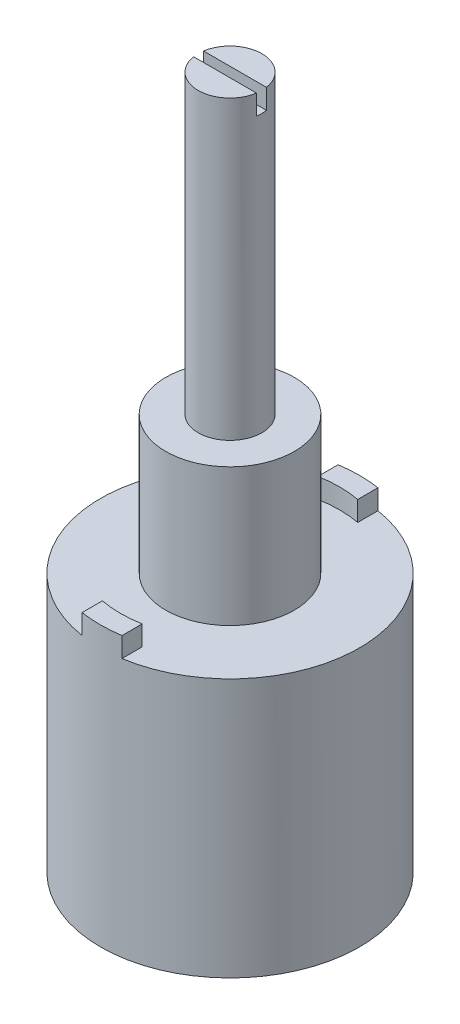
ISO-10303-21;
HEADER;
FILE_DESCRIPTION(('STEP AP214'),'2;1');
FILE_NAME('part.step','',(''),(''),'','','');
FILE_SCHEMA(('AUTOMOTIVE_DESIGN { 1 0 10303 214 1 1 1 1 }'));
ENDSEC;
DATA;
#1=APPLICATION_CONTEXT('core data for automotive mechanical design processes');
#2=APPLICATION_PROTOCOL_DEFINITION('international standard','automotive_design',2000,#1);
#3=PRODUCT_CONTEXT('',#1,'mechanical');
#4=PRODUCT('Part','Part','',(#3));
#5=PRODUCT_RELATED_PRODUCT_CATEGORY('part','',(#4));
#6=PRODUCT_DEFINITION_FORMATION('','',#4);
#7=PRODUCT_DEFINITION_CONTEXT('part definition',#1,'design');
#8=PRODUCT_DEFINITION('design','',#6,#7);
#9=PRODUCT_DEFINITION_SHAPE('','',#8);
#10=(LENGTH_UNIT() NAMED_UNIT(*) SI_UNIT(.MILLI.,.METRE.));
#11=(NAMED_UNIT(*) PLANE_ANGLE_UNIT() SI_UNIT($,.RADIAN.));
#12=(NAMED_UNIT(*) SI_UNIT($,.STERADIAN.) SOLID_ANGLE_UNIT());
#13=UNCERTAINTY_MEASURE_WITH_UNIT(LENGTH_MEASURE(1.E-05),#10,'distance_accuracy_value','');
#14=(GEOMETRIC_REPRESENTATION_CONTEXT(3) GLOBAL_UNCERTAINTY_ASSIGNED_CONTEXT((#13)) GLOBAL_UNIT_ASSIGNED_CONTEXT((#10,
#11,#12)) REPRESENTATION_CONTEXT('',''));
#15=CARTESIAN_POINT('',(0.,0.,0.));
#16=DIRECTION('',(0.,0.,1.));
#17=DIRECTION('',(1.,0.,0.));
#18=AXIS2_PLACEMENT_3D('',#15,#16,#17);
#19=CARTESIAN_POINT('',(0.,34.78,0.));
#20=DIRECTION('',(0.,-1.,0.));
#21=DIRECTION('',(0.,0.,-1.));
#22=AXIS2_PLACEMENT_3D('',#19,#20,#21);
#23=CYLINDRICAL_SURFACE('',#22,1.6);
#24=CARTESIAN_POINT('',(0.,19.9,0.));
#25=DIRECTION('',(0.,1.,0.));
#26=DIRECTION('',(0.,0.,1.));
#27=AXIS2_PLACEMENT_3D('',#24,#25,#26);
#28=CIRCLE('',#27,1.6);
#29=CARTESIAN_POINT('',(0.,19.9,1.6));
#30=VERTEX_POINT('',#29);
#31=EDGE_CURVE('E205',#30,#30,#28,.T.);
#32=ORIENTED_EDGE('',*,*,#31,.T.);
#33=EDGE_LOOP('',(#32));
#34=FACE_BOUND('',#33,.T.);
#35=DIRECTION('',(0.,1.,0.));
#36=VECTOR('',#35,1.);
#37=CARTESIAN_POINT('',(1.58034806292791,33.78,0.25));
#38=LINE('',#37,#36);
#39=CARTESIAN_POINT('',(1.58034806292791,33.78,0.25));
#40=VERTEX_POINT('',#39);
#41=CARTESIAN_POINT('',(1.58034806292791,34.78,0.25));
#42=VERTEX_POINT('',#41);
#43=EDGE_CURVE('E161',#40,#42,#38,.T.);
#44=ORIENTED_EDGE('',*,*,#43,.T.);
#45=CARTESIAN_POINT('',(0.,34.78,0.));
#46=DIRECTION('',(0.,1.,0.));
#47=DIRECTION('',(0.,0.,1.));
#48=AXIS2_PLACEMENT_3D('',#45,#46,#47);
#49=CIRCLE('',#48,1.6);
#50=CARTESIAN_POINT('',(-1.58034806292791,34.78,0.25));
#51=VERTEX_POINT('',#50);
#52=EDGE_CURVE('E206',#51,#42,#49,.T.);
#53=ORIENTED_EDGE('',*,*,#52,.F.);
#54=DIRECTION('',(0.,1.,0.));
#55=VECTOR('',#54,1.);
#56=CARTESIAN_POINT('',(-1.58034806292791,33.78,0.25));
#57=LINE('',#56,#55);
#58=CARTESIAN_POINT('',(-1.58034806292791,33.78,0.25));
#59=VERTEX_POINT('',#58);
#60=EDGE_CURVE('E142',#59,#51,#57,.T.);
#61=ORIENTED_EDGE('',*,*,#60,.F.);
#62=CARTESIAN_POINT('',(0.,33.78,0.));
#63=DIRECTION('',(0.,1.,0.));
#64=DIRECTION('',(0.,0.,1.));
#65=AXIS2_PLACEMENT_3D('',#62,#63,#64);
#66=CIRCLE('',#65,1.6);
#67=CARTESIAN_POINT('',(-1.58034806292791,33.78,-0.25));
#68=VERTEX_POINT('',#67);
#69=EDGE_CURVE('E127',#68,#59,#66,.T.);
#70=ORIENTED_EDGE('',*,*,#69,.F.);
#71=DIRECTION('',(0.,1.,0.));
#72=VECTOR('',#71,1.);
#73=CARTESIAN_POINT('',(-1.58034806292791,33.78,-0.25));
#74=LINE('',#73,#72);
#75=CARTESIAN_POINT('',(-1.58034806292791,34.78,-0.25));
#76=VERTEX_POINT('',#75);
#77=EDGE_CURVE('E123',#68,#76,#74,.T.);
#78=ORIENTED_EDGE('',*,*,#77,.T.);
#79=CARTESIAN_POINT('',(1.58034806292791,34.78,-0.25));
#80=VERTEX_POINT('',#79);
#81=EDGE_CURVE('E140',#80,#76,#49,.T.);
#82=ORIENTED_EDGE('',*,*,#81,.F.);
#83=DIRECTION('',(0.,1.,0.));
#84=VECTOR('',#83,1.);
#85=CARTESIAN_POINT('',(1.58034806292791,33.78,-0.25));
#86=LINE('',#85,#84);
#87=CARTESIAN_POINT('',(1.58034806292791,33.78,-0.25));
#88=VERTEX_POINT('',#87);
#89=EDGE_CURVE('E48',#88,#80,#86,.T.);
#90=ORIENTED_EDGE('',*,*,#89,.F.);
#91=EDGE_CURVE('E128',#40,#88,#66,.T.);
#92=ORIENTED_EDGE('',*,*,#91,.F.);
#93=EDGE_LOOP('',(#44,#53,#61,#70,#78,#82,#90,#92));
#94=FACE_BOUND('',#93,.T.);
#95=ADVANCED_FACE('F32',(#34,#94),#23,.T.);
#96=CARTESIAN_POINT('',(0.,34.78,0.));
#97=DIRECTION('',(0.,1.,0.));
#98=DIRECTION('',(0.,0.,1.));
#99=AXIS2_PLACEMENT_3D('',#96,#97,#98);
#100=PLANE('',#99);
#101=ORIENTED_EDGE('',*,*,#52,.T.);
#102=DIRECTION('',(-1.,0.,0.));
#103=VECTOR('',#102,1.);
#104=CARTESIAN_POINT('',(0.,34.78,0.25));
#105=LINE('',#104,#103);
#106=EDGE_CURVE('E136',#42,#51,#105,.T.);
#107=ORIENTED_EDGE('',*,*,#106,.T.);
#108=EDGE_LOOP('',(#101,#107));
#109=FACE_BOUND('',#108,.T.);
#110=ADVANCED_FACE('F230',(#109),#100,.T.);
#111=CARTESIAN_POINT('',(0.,13.,0.));
#112=DIRECTION('',(0.,1.,0.));
#113=DIRECTION('',(0.,0.,1.));
#114=AXIS2_PLACEMENT_3D('',#111,#112,#113);
#115=PLANE('',#114);
#116=CARTESIAN_POINT('',(0.,13.,0.));
#117=DIRECTION('',(0.,1.,0.));
#118=DIRECTION('',(0.,0.,1.));
#119=AXIS2_PLACEMENT_3D('',#116,#117,#118);
#120=CIRCLE('',#119,3.225);
#121=CARTESIAN_POINT('',(0.,13.,-3.225));
#122=VERTEX_POINT('',#121);
#123=EDGE_CURVE('E214',#122,#122,#120,.T.);
#124=ORIENTED_EDGE('',*,*,#123,.F.);
#125=EDGE_LOOP('',(#124));
#126=FACE_BOUND('',#125,.T.);
#127=CARTESIAN_POINT('',(0.,13.,0.));
#128=DIRECTION('',(0.,1.,0.));
#129=DIRECTION('',(0.,0.,1.));
#130=AXIS2_PLACEMENT_3D('',#127,#128,#129);
#131=CIRCLE('',#130,6.5);
#132=CARTESIAN_POINT('',(-1.,13.,-6.42261628933257));
#133=VERTEX_POINT('',#132);
#134=CARTESIAN_POINT('',(-1.,13.,6.42261628933257));
#135=VERTEX_POINT('',#134);
#136=EDGE_CURVE('E11',#133,#135,#131,.T.);
#137=ORIENTED_EDGE('',*,*,#136,.T.);
#138=DIRECTION('',(0.,0.,1.));
#139=VECTOR('',#138,1.);
#140=CARTESIAN_POINT('',(-1.,13.,0.));
#141=LINE('',#140,#139);
#142=CARTESIAN_POINT('',(-1.,13.,5.40832691319598));
#143=VERTEX_POINT('',#142);
#144=EDGE_CURVE('E55',#143,#135,#141,.T.);
#145=ORIENTED_EDGE('',*,*,#144,.F.);
#146=CARTESIAN_POINT('',(0.,13.,0.));
#147=DIRECTION('',(0.,1.,0.));
#148=DIRECTION('',(0.,0.,1.));
#149=AXIS2_PLACEMENT_3D('',#146,#147,#148);
#150=CIRCLE('',#149,5.5);
#151=CARTESIAN_POINT('',(1.,13.,5.40832691319598));
#152=VERTEX_POINT('',#151);
#153=EDGE_CURVE('E159',#143,#152,#150,.T.);
#154=ORIENTED_EDGE('',*,*,#153,.T.);
#155=DIRECTION('',(0.,0.,1.));
#156=VECTOR('',#155,1.);
#157=CARTESIAN_POINT('',(1.,13.,0.));
#158=LINE('',#157,#156);
#159=CARTESIAN_POINT('',(1.,13.,6.42261628933257));
#160=VERTEX_POINT('',#159);
#161=EDGE_CURVE('E151',#152,#160,#158,.T.);
#162=ORIENTED_EDGE('',*,*,#161,.T.);
#163=CARTESIAN_POINT('',(1.,13.,-6.42261628933257));
#164=VERTEX_POINT('',#163);
#165=EDGE_CURVE('E41',#160,#164,#131,.T.);
#166=ORIENTED_EDGE('',*,*,#165,.T.);
#167=DIRECTION('',(0.,0.,1.));
#168=VECTOR('',#167,1.);
#169=CARTESIAN_POINT('',(1.,13.,0.));
#170=LINE('',#169,#168);
#171=CARTESIAN_POINT('',(1.,13.,-5.40832691319598));
#172=VERTEX_POINT('',#171);
#173=EDGE_CURVE('E190',#164,#172,#170,.T.);
#174=ORIENTED_EDGE('',*,*,#173,.T.);
#175=CARTESIAN_POINT('',(0.,13.,0.));
#176=DIRECTION('',(0.,1.,0.));
#177=DIRECTION('',(0.,0.,1.));
#178=AXIS2_PLACEMENT_3D('',#175,#176,#177);
#179=CIRCLE('',#178,5.5);
#180=CARTESIAN_POINT('',(-1.,13.,-5.40832691319598));
#181=VERTEX_POINT('',#180);
#182=EDGE_CURVE('E175',#172,#181,#179,.T.);
#183=ORIENTED_EDGE('',*,*,#182,.T.);
#184=DIRECTION('',(0.,0.,-1.));
#185=VECTOR('',#184,1.);
#186=CARTESIAN_POINT('',(-1.,13.,0.));
#187=LINE('',#186,#185);
#188=EDGE_CURVE('E180',#181,#133,#187,.T.);
#189=ORIENTED_EDGE('',*,*,#188,.T.);
#190=EDGE_LOOP('',(#137,#145,#154,#162,#166,#174,#183,#189));
#191=FACE_BOUND('',#190,.T.);
#192=ADVANCED_FACE('F232',(#126,#191),#115,.T.);
#193=CARTESIAN_POINT('',(0.,19.9,0.));
#194=DIRECTION('',(0.,1.,0.));
#195=DIRECTION('',(0.,0.,1.));
#196=AXIS2_PLACEMENT_3D('',#193,#194,#195);
#197=PLANE('',#196);
#198=CARTESIAN_POINT('',(0.,19.9,0.));
#199=DIRECTION('',(0.,1.,0.));
#200=DIRECTION('',(0.,0.,1.));
#201=AXIS2_PLACEMENT_3D('',#198,#199,#200);
#202=CIRCLE('',#201,3.225);
#203=CARTESIAN_POINT('',(0.,19.9,-3.225));
#204=VERTEX_POINT('',#203);
#205=EDGE_CURVE('E211',#204,#204,#202,.T.);
#206=ORIENTED_EDGE('',*,*,#205,.T.);
#207=EDGE_LOOP('',(#206));
#208=FACE_BOUND('',#207,.T.);
#209=ORIENTED_EDGE('',*,*,#31,.F.);
#210=EDGE_LOOP('',(#209));
#211=FACE_BOUND('',#210,.T.);
#212=ADVANCED_FACE('F238',(#208,#211),#197,.T.);
#213=CARTESIAN_POINT('',(0.,13.,0.));
#214=DIRECTION('',(0.,-1.,0.));
#215=DIRECTION('',(0.,0.,-1.));
#216=AXIS2_PLACEMENT_3D('',#213,#214,#215);
#217=CYLINDRICAL_SURFACE('',#216,6.5);
#218=ORIENTED_EDGE('',*,*,#136,.F.);
#219=DIRECTION('',(0.,-1.,0.));
#220=VECTOR('',#219,1.);
#221=CARTESIAN_POINT('',(-1.,14.,-6.42261628933257));
#222=LINE('',#221,#220);
#223=CARTESIAN_POINT('',(-1.,14.,-6.42261628933257));
#224=VERTEX_POINT('',#223);
#225=EDGE_CURVE('E196',#224,#133,#222,.T.);
#226=ORIENTED_EDGE('',*,*,#225,.F.);
#227=CARTESIAN_POINT('',(0.,14.,0.));
#228=DIRECTION('',(0.,1.,0.));
#229=DIRECTION('',(0.,0.,1.));
#230=AXIS2_PLACEMENT_3D('',#227,#228,#229);
#231=CIRCLE('',#230,6.5);
#232=CARTESIAN_POINT('',(1.,14.,-6.42261628933257));
#233=VERTEX_POINT('',#232);
#234=EDGE_CURVE('E183',#233,#224,#231,.T.);
#235=ORIENTED_EDGE('',*,*,#234,.F.);
#236=DIRECTION('',(0.,-1.,0.));
#237=VECTOR('',#236,1.);
#238=CARTESIAN_POINT('',(1.,14.,-6.42261628933257));
#239=LINE('',#238,#237);
#240=EDGE_CURVE('E199',#233,#164,#239,.T.);
#241=ORIENTED_EDGE('',*,*,#240,.T.);
#242=ORIENTED_EDGE('',*,*,#165,.F.);
#243=DIRECTION('',(0.,-1.,0.));
#244=VECTOR('',#243,1.);
#245=CARTESIAN_POINT('',(1.,14.,6.42261628933257));
#246=LINE('',#245,#244);
#247=CARTESIAN_POINT('',(1.,14.,6.42261628933257));
#248=VERTEX_POINT('',#247);
#249=EDGE_CURVE('E167',#248,#160,#246,.T.);
#250=ORIENTED_EDGE('',*,*,#249,.F.);
#251=CARTESIAN_POINT('',(0.,14.,0.));
#252=DIRECTION('',(0.,1.,0.));
#253=DIRECTION('',(0.,0.,1.));
#254=AXIS2_PLACEMENT_3D('',#251,#252,#253);
#255=CIRCLE('',#254,6.5);
#256=CARTESIAN_POINT('',(-1.,14.,6.42261628933257));
#257=VERTEX_POINT('',#256);
#258=EDGE_CURVE('E153',#257,#248,#255,.T.);
#259=ORIENTED_EDGE('',*,*,#258,.F.);
#260=DIRECTION('',(0.,-1.,0.));
#261=VECTOR('',#260,1.);
#262=CARTESIAN_POINT('',(-1.,14.,6.42261628933257));
#263=LINE('',#262,#261);
#264=EDGE_CURVE('E170',#257,#135,#263,.T.);
#265=ORIENTED_EDGE('',*,*,#264,.T.);
#266=EDGE_LOOP('',(#218,#226,#235,#241,#242,#250,#259,#265));
#267=FACE_BOUND('',#266,.T.);
#268=CARTESIAN_POINT('',(0.,0.,0.));
#269=DIRECTION('',(0.,1.,0.));
#270=DIRECTION('',(0.,0.,1.));
#271=AXIS2_PLACEMENT_3D('',#268,#269,#270);
#272=CIRCLE('',#271,6.5);
#273=CARTESIAN_POINT('',(0.,0.,6.5));
#274=VERTEX_POINT('',#273);
#275=EDGE_CURVE('E36',#274,#274,#272,.T.);
#276=ORIENTED_EDGE('',*,*,#275,.T.);
#277=EDGE_LOOP('',(#276));
#278=FACE_BOUND('',#277,.T.);
#279=ADVANCED_FACE('F34',(#267,#278),#217,.T.);
#280=CARTESIAN_POINT('',(0.,0.,0.));
#281=DIRECTION('',(0.,1.,0.));
#282=DIRECTION('',(0.,0.,1.));
#283=AXIS2_PLACEMENT_3D('',#280,#281,#282);
#284=PLANE('',#283);
#285=ORIENTED_EDGE('',*,*,#275,.F.);
#286=EDGE_LOOP('',(#285));
#287=FACE_BOUND('',#286,.T.);
#288=ADVANCED_FACE('F253',(#287),#284,.F.);
#289=CARTESIAN_POINT('',(0.,19.9,0.));
#290=DIRECTION('',(0.,-1.,0.));
#291=DIRECTION('',(0.,0.,-1.));
#292=AXIS2_PLACEMENT_3D('',#289,#290,#291);
#293=CYLINDRICAL_SURFACE('',#292,3.225);
#294=CARTESIAN_POINT('',(0.,19.9,-3.225));
#295=CARTESIAN_POINT('',(0.,19.828125,-3.225));
#296=CARTESIAN_POINT('',(0.,19.75625,-3.225));
#297=CARTESIAN_POINT('',(0.,19.6125,-3.225));
#298=CARTESIAN_POINT('',(0.,19.540625,-3.225));
#299=CARTESIAN_POINT('',(0.,19.396875,-3.225));
#300=CARTESIAN_POINT('',(0.,19.325,-3.225));
#301=CARTESIAN_POINT('',(0.,19.18125,-3.225));
#302=CARTESIAN_POINT('',(0.,19.109375,-3.225));
#303=CARTESIAN_POINT('',(0.,18.965625,-3.225));
#304=CARTESIAN_POINT('',(0.,18.89375,-3.225));
#305=CARTESIAN_POINT('',(0.,18.75,-3.225));
#306=CARTESIAN_POINT('',(0.,18.678125,-3.225));
#307=CARTESIAN_POINT('',(0.,18.534375,-3.225));
#308=CARTESIAN_POINT('',(0.,18.4625,-3.225));
#309=CARTESIAN_POINT('',(0.,18.31875,-3.225));
#310=CARTESIAN_POINT('',(0.,18.246875,-3.225));
#311=CARTESIAN_POINT('',(0.,18.103125,-3.225));
#312=CARTESIAN_POINT('',(0.,18.03125,-3.225));
#313=CARTESIAN_POINT('',(0.,17.8875,-3.225));
#314=CARTESIAN_POINT('',(0.,17.815625,-3.225));
#315=CARTESIAN_POINT('',(0.,17.671875,-3.225));
#316=CARTESIAN_POINT('',(0.,17.6,-3.225));
#317=CARTESIAN_POINT('',(0.,17.45625,-3.225));
#318=CARTESIAN_POINT('',(0.,17.384375,-3.225));
#319=CARTESIAN_POINT('',(0.,17.240625,-3.225));
#320=CARTESIAN_POINT('',(0.,17.16875,-3.225));
#321=CARTESIAN_POINT('',(0.,17.025,-3.225));
#322=CARTESIAN_POINT('',(0.,16.953125,-3.225));
#323=CARTESIAN_POINT('',(0.,16.809375,-3.225));
#324=CARTESIAN_POINT('',(0.,16.7375,-3.225));
#325=CARTESIAN_POINT('',(0.,16.59375,-3.225));
#326=CARTESIAN_POINT('',(0.,16.521875,-3.225));
#327=CARTESIAN_POINT('',(0.,16.378125,-3.225));
#328=CARTESIAN_POINT('',(0.,16.30625,-3.225));
#329=CARTESIAN_POINT('',(0.,16.1625,-3.225));
#330=CARTESIAN_POINT('',(0.,16.090625,-3.225));
#331=CARTESIAN_POINT('',(0.,15.946875,-3.225));
#332=CARTESIAN_POINT('',(0.,15.875,-3.225));
#333=CARTESIAN_POINT('',(0.,15.73125,-3.225));
#334=CARTESIAN_POINT('',(0.,15.659375,-3.225));
#335=CARTESIAN_POINT('',(0.,15.515625,-3.225));
#336=CARTESIAN_POINT('',(0.,15.44375,-3.225));
#337=CARTESIAN_POINT('',(0.,15.3,-3.225));
#338=CARTESIAN_POINT('',(0.,15.228125,-3.225));
#339=CARTESIAN_POINT('',(0.,15.084375,-3.225));
#340=CARTESIAN_POINT('',(0.,15.0125,-3.225));
#341=CARTESIAN_POINT('',(0.,14.86875,-3.225));
#342=CARTESIAN_POINT('',(0.,14.796875,-3.225));
#343=CARTESIAN_POINT('',(0.,14.653125,-3.225));
#344=CARTESIAN_POINT('',(0.,14.58125,-3.225));
#345=CARTESIAN_POINT('',(0.,14.4375,-3.225));
#346=CARTESIAN_POINT('',(0.,14.365625,-3.225));
#347=CARTESIAN_POINT('',(0.,14.221875,-3.225));
#348=CARTESIAN_POINT('',(0.,14.15,-3.225));
#349=CARTESIAN_POINT('',(0.,14.00625,-3.225));
#350=CARTESIAN_POINT('',(0.,13.934375,-3.225));
#351=CARTESIAN_POINT('',(0.,13.790625,-3.225));
#352=CARTESIAN_POINT('',(0.,13.71875,-3.225));
#353=CARTESIAN_POINT('',(0.,13.575,-3.225));
#354=CARTESIAN_POINT('',(0.,13.503125,-3.225));
#355=CARTESIAN_POINT('',(0.,13.359375,-3.225));
#356=CARTESIAN_POINT('',(0.,13.2875,-3.225));
#357=CARTESIAN_POINT('',(0.,13.14375,-3.225));
#358=CARTESIAN_POINT('',(0.,13.071875,-3.225));
#359=CARTESIAN_POINT('',(0.,13.,-3.225));
#360=B_SPLINE_CURVE_WITH_KNOTS('',3,(#294,#295,#296,#297,#298,#299,#300,#301,#302,#303,#304,
#305,#306,#307,#308,#309,#310,#311,#312,#313,#314,#315,#316,#317,#318,#319,#320,#321,#322,#323,
#324,#325,#326,#327,#328,#329,#330,#331,#332,#333,#334,#335,#336,#337,#338,#339,#340,#341,#342,
#343,#344,#345,#346,#347,#348,#349,#350,#351,#352,#353,#354,#355,#356,#357,#358,#359),
.UNSPECIFIED.,.F.,.F.,(4,2,2,2,2,2,2,2,2,2,2,2,2,2,2,2,2,2,2,2,2,2,2,2,2,2,2,2,2,2,2,2,4),(0.,
0.215624999999997,0.431249999999998,0.646874999999998,0.862499999999999,1.078125,1.29375,
1.509375,1.725,1.940625,2.15625,2.371875,2.5875,2.803125,3.01875,3.234375,3.45,3.665625,3.88125,
4.096875,4.3125,4.528125,4.74375,4.959375,5.175,5.390625,5.60625,5.821875,6.0375,6.253125,
6.46875,6.684375,6.9),.UNSPECIFIED.);
#361=EDGE_CURVE('BSEAM246',#204,#122,#360,.T.);
#362=ORIENTED_EDGE('',*,*,#205,.F.);
#363=ORIENTED_EDGE('',*,*,#123,.T.);
#364=ORIENTED_EDGE('',*,*,#361,.T.);
#365=ORIENTED_EDGE('',*,*,#361,.F.);
#366=EDGE_LOOP('',(#362,#364,#363,#365));
#367=FACE_BOUND('',#366,.T.);
#368=ADVANCED_FACE('F246',(#367),#293,.T.);
#369=DIRECTION('',(-1.,0.,0.));
#370=VECTOR('',#369,1.);
#371=CARTESIAN_POINT('',(0.,34.78,-0.25));
#372=LINE('',#371,#370);
#373=EDGE_CURVE('E220',#80,#76,#372,.T.);
#374=ORIENTED_EDGE('',*,*,#373,.F.);
#375=ORIENTED_EDGE('',*,*,#81,.T.);
#376=EDGE_LOOP('',(#374,#375));
#377=FACE_BOUND('',#376,.T.);
#378=ADVANCED_FACE('F219',(#377),#100,.T.);
#379=CARTESIAN_POINT('',(0.,14.,0.));
#380=DIRECTION('',(0.,-1.,0.));
#381=DIRECTION('',(0.,0.,-1.));
#382=AXIS2_PLACEMENT_3D('',#379,#380,#381);
#383=CYLINDRICAL_SURFACE('',#382,5.5);
#384=ORIENTED_EDGE('',*,*,#182,.F.);
#385=DIRECTION('',(0.,-1.,0.));
#386=VECTOR('',#385,1.);
#387=CARTESIAN_POINT('',(1.,14.,-5.40832691319598));
#388=LINE('',#387,#386);
#389=CARTESIAN_POINT('',(1.,14.,-5.40832691319598));
#390=VERTEX_POINT('',#389);
#391=EDGE_CURVE('E202',#390,#172,#388,.T.);
#392=ORIENTED_EDGE('',*,*,#391,.F.);
#393=CARTESIAN_POINT('',(0.,14.,0.));
#394=DIRECTION('',(0.,1.,0.));
#395=DIRECTION('',(0.,0.,1.));
#396=AXIS2_PLACEMENT_3D('',#393,#394,#395);
#397=CIRCLE('',#396,5.5);
#398=CARTESIAN_POINT('',(-1.,14.,-5.40832691319598));
#399=VERTEX_POINT('',#398);
#400=EDGE_CURVE('E176',#390,#399,#397,.T.);
#401=ORIENTED_EDGE('',*,*,#400,.T.);
#402=DIRECTION('',(0.,-1.,0.));
#403=VECTOR('',#402,1.);
#404=CARTESIAN_POINT('',(-1.,14.,-5.40832691319598));
#405=LINE('',#404,#403);
#406=EDGE_CURVE('E188',#399,#181,#405,.T.);
#407=ORIENTED_EDGE('',*,*,#406,.T.);
#408=EDGE_LOOP('',(#384,#392,#401,#407));
#409=FACE_BOUND('',#408,.T.);
#410=ADVANCED_FACE('F245',(#409),#383,.F.);
#411=CARTESIAN_POINT('',(1.,14.,0.));
#412=DIRECTION('',(1.,0.,0.));
#413=DIRECTION('',(0.,0.,-1.));
#414=AXIS2_PLACEMENT_3D('',#411,#412,#413);
#415=PLANE('',#414);
#416=ORIENTED_EDGE('',*,*,#173,.F.);
#417=ORIENTED_EDGE('',*,*,#240,.F.);
#418=DIRECTION('',(0.,0.,1.));
#419=VECTOR('',#418,1.);
#420=CARTESIAN_POINT('',(1.,14.,0.));
#421=LINE('',#420,#419);
#422=EDGE_CURVE('E179',#233,#390,#421,.T.);
#423=ORIENTED_EDGE('',*,*,#422,.T.);
#424=ORIENTED_EDGE('',*,*,#391,.T.);
#425=EDGE_LOOP('',(#416,#417,#423,#424));
#426=FACE_BOUND('',#425,.T.);
#427=ADVANCED_FACE('F251',(#426),#415,.T.);
#428=CARTESIAN_POINT('',(-1.,14.,0.));
#429=DIRECTION('',(-1.,0.,0.));
#430=DIRECTION('',(0.,0.,1.));
#431=AXIS2_PLACEMENT_3D('',#428,#429,#430);
#432=PLANE('',#431);
#433=ORIENTED_EDGE('',*,*,#188,.F.);
#434=ORIENTED_EDGE('',*,*,#406,.F.);
#435=DIRECTION('',(0.,0.,-1.));
#436=VECTOR('',#435,1.);
#437=CARTESIAN_POINT('',(-1.,14.,0.));
#438=LINE('',#437,#436);
#439=EDGE_CURVE('E185',#399,#224,#438,.T.);
#440=ORIENTED_EDGE('',*,*,#439,.T.);
#441=ORIENTED_EDGE('',*,*,#225,.T.);
#442=EDGE_LOOP('',(#433,#434,#440,#441));
#443=FACE_BOUND('',#442,.T.);
#444=ADVANCED_FACE('F286',(#443),#432,.T.);
#445=CARTESIAN_POINT('',(0.,14.,0.));
#446=DIRECTION('',(0.,1.,0.));
#447=DIRECTION('',(0.,0.,1.));
#448=AXIS2_PLACEMENT_3D('',#445,#446,#447);
#449=PLANE('',#448);
#450=ORIENTED_EDGE('',*,*,#400,.F.);
#451=ORIENTED_EDGE('',*,*,#422,.F.);
#452=ORIENTED_EDGE('',*,*,#234,.T.);
#453=ORIENTED_EDGE('',*,*,#439,.F.);
#454=EDGE_LOOP('',(#450,#451,#452,#453));
#455=FACE_BOUND('',#454,.T.);
#456=ADVANCED_FACE('F289',(#455),#449,.T.);
#457=CARTESIAN_POINT('',(0.,14.,0.));
#458=DIRECTION('',(0.,-1.,0.));
#459=DIRECTION('',(0.,0.,-1.));
#460=AXIS2_PLACEMENT_3D('',#457,#458,#459);
#461=CYLINDRICAL_SURFACE('',#460,5.5);
#462=ORIENTED_EDGE('',*,*,#153,.F.);
#463=DIRECTION('',(0.,-1.,0.));
#464=VECTOR('',#463,1.);
#465=CARTESIAN_POINT('',(-1.,14.,5.40832691319598));
#466=LINE('',#465,#464);
#467=CARTESIAN_POINT('',(-1.,14.,5.40832691319598));
#468=VERTEX_POINT('',#467);
#469=EDGE_CURVE('E173',#468,#143,#466,.T.);
#470=ORIENTED_EDGE('',*,*,#469,.F.);
#471=CARTESIAN_POINT('',(0.,14.,0.));
#472=DIRECTION('',(0.,1.,0.));
#473=DIRECTION('',(0.,0.,1.));
#474=AXIS2_PLACEMENT_3D('',#471,#472,#473);
#475=CIRCLE('',#474,5.5);
#476=CARTESIAN_POINT('',(1.,14.,5.40832691319598));
#477=VERTEX_POINT('',#476);
#478=EDGE_CURVE('E147',#468,#477,#475,.T.);
#479=ORIENTED_EDGE('',*,*,#478,.T.);
#480=DIRECTION('',(0.,-1.,0.));
#481=VECTOR('',#480,1.);
#482=CARTESIAN_POINT('',(1.,14.,5.40832691319598));
#483=LINE('',#482,#481);
#484=EDGE_CURVE('E158',#477,#152,#483,.T.);
#485=ORIENTED_EDGE('',*,*,#484,.T.);
#486=EDGE_LOOP('',(#462,#470,#479,#485));
#487=FACE_BOUND('',#486,.T.);
#488=ADVANCED_FACE('F291',(#487),#461,.F.);
#489=CARTESIAN_POINT('',(-1.,14.,0.));
#490=DIRECTION('',(1.,0.,0.));
#491=DIRECTION('',(0.,0.,-1.));
#492=AXIS2_PLACEMENT_3D('',#489,#490,#491);
#493=PLANE('',#492);
#494=ORIENTED_EDGE('',*,*,#144,.T.);
#495=ORIENTED_EDGE('',*,*,#264,.F.);
#496=DIRECTION('',(0.,0.,1.));
#497=VECTOR('',#496,1.);
#498=CARTESIAN_POINT('',(-1.,14.,0.));
#499=LINE('',#498,#497);
#500=EDGE_CURVE('E150',#468,#257,#499,.T.);
#501=ORIENTED_EDGE('',*,*,#500,.F.);
#502=ORIENTED_EDGE('',*,*,#469,.T.);
#503=EDGE_LOOP('',(#494,#495,#501,#502));
#504=FACE_BOUND('',#503,.T.);
#505=ADVANCED_FACE('F297',(#504),#493,.F.);
#506=CARTESIAN_POINT('',(1.,14.,0.));
#507=DIRECTION('',(1.,0.,0.));
#508=DIRECTION('',(0.,0.,-1.));
#509=AXIS2_PLACEMENT_3D('',#506,#507,#508);
#510=PLANE('',#509);
#511=ORIENTED_EDGE('',*,*,#161,.F.);
#512=ORIENTED_EDGE('',*,*,#484,.F.);
#513=DIRECTION('',(0.,0.,1.));
#514=VECTOR('',#513,1.);
#515=CARTESIAN_POINT('',(1.,14.,0.));
#516=LINE('',#515,#514);
#517=EDGE_CURVE('E155',#477,#248,#516,.T.);
#518=ORIENTED_EDGE('',*,*,#517,.T.);
#519=ORIENTED_EDGE('',*,*,#249,.T.);
#520=EDGE_LOOP('',(#511,#512,#518,#519));
#521=FACE_BOUND('',#520,.T.);
#522=ADVANCED_FACE('F333',(#521),#510,.T.);
#523=CARTESIAN_POINT('',(0.,14.,0.));
#524=DIRECTION('',(0.,1.,0.));
#525=DIRECTION('',(0.,0.,1.));
#526=AXIS2_PLACEMENT_3D('',#523,#524,#525);
#527=PLANE('',#526);
#528=ORIENTED_EDGE('',*,*,#478,.F.);
#529=ORIENTED_EDGE('',*,*,#500,.T.);
#530=ORIENTED_EDGE('',*,*,#258,.T.);
#531=ORIENTED_EDGE('',*,*,#517,.F.);
#532=EDGE_LOOP('',(#528,#529,#530,#531));
#533=FACE_BOUND('',#532,.T.);
#534=ADVANCED_FACE('F343',(#533),#527,.T.);
#535=CARTESIAN_POINT('',(0.,33.78,0.25));
#536=DIRECTION('',(0.,0.,-1.));
#537=DIRECTION('',(-1.,0.,0.));
#538=AXIS2_PLACEMENT_3D('',#535,#536,#537);
#539=PLANE('',#538);
#540=ORIENTED_EDGE('',*,*,#106,.F.);
#541=ORIENTED_EDGE('',*,*,#43,.F.);
#542=DIRECTION('',(-1.,0.,0.));
#543=VECTOR('',#542,1.);
#544=CARTESIAN_POINT('',(0.,33.78,0.25));
#545=LINE('',#544,#543);
#546=EDGE_CURVE('E133',#40,#59,#545,.T.);
#547=ORIENTED_EDGE('',*,*,#546,.T.);
#548=ORIENTED_EDGE('',*,*,#60,.T.);
#549=EDGE_LOOP('',(#540,#541,#547,#548));
#550=FACE_BOUND('',#549,.T.);
#551=ADVANCED_FACE('F227',(#550),#539,.T.);
#552=CARTESIAN_POINT('',(0.,33.78,-0.25));
#553=DIRECTION('',(0.,0.,-1.));
#554=DIRECTION('',(-1.,0.,0.));
#555=AXIS2_PLACEMENT_3D('',#552,#553,#554);
#556=PLANE('',#555);
#557=ORIENTED_EDGE('',*,*,#373,.T.);
#558=ORIENTED_EDGE('',*,*,#77,.F.);
#559=DIRECTION('',(-1.,0.,0.));
#560=VECTOR('',#559,1.);
#561=CARTESIAN_POINT('',(0.,33.78,-0.25));
#562=LINE('',#561,#560);
#563=EDGE_CURVE('E119',#88,#68,#562,.T.);
#564=ORIENTED_EDGE('',*,*,#563,.F.);
#565=ORIENTED_EDGE('',*,*,#89,.T.);
#566=EDGE_LOOP('',(#557,#558,#564,#565));
#567=FACE_BOUND('',#566,.T.);
#568=ADVANCED_FACE('F121',(#567),#556,.F.);
#569=CARTESIAN_POINT('',(0.,33.78,0.));
#570=DIRECTION('',(0.,1.,0.));
#571=DIRECTION('',(0.,0.,1.));
#572=AXIS2_PLACEMENT_3D('',#569,#570,#571);
#573=PLANE('',#572);
#574=ORIENTED_EDGE('',*,*,#91,.T.);
#575=ORIENTED_EDGE('',*,*,#563,.T.);
#576=ORIENTED_EDGE('',*,*,#69,.T.);
#577=ORIENTED_EDGE('',*,*,#546,.F.);
#578=EDGE_LOOP('',(#574,#575,#576,#577));
#579=FACE_BOUND('',#578,.T.);
#580=ADVANCED_FACE('F132',(#579),#573,.T.);
#581=CLOSED_SHELL('',(#95,#110,#192,#212,#279,#288,#368,#378,#410,#427,#444,#456,#488,#505,#522,
#534,#551,#568,#580));
#582=MANIFOLD_SOLID_BREP('B2',#581);
#583=ADVANCED_BREP_SHAPE_REPRESENTATION('',(#18,#582),#14);
#584=SHAPE_DEFINITION_REPRESENTATION(#9,#583);
ENDSEC;
END-ISO-10303-21;
